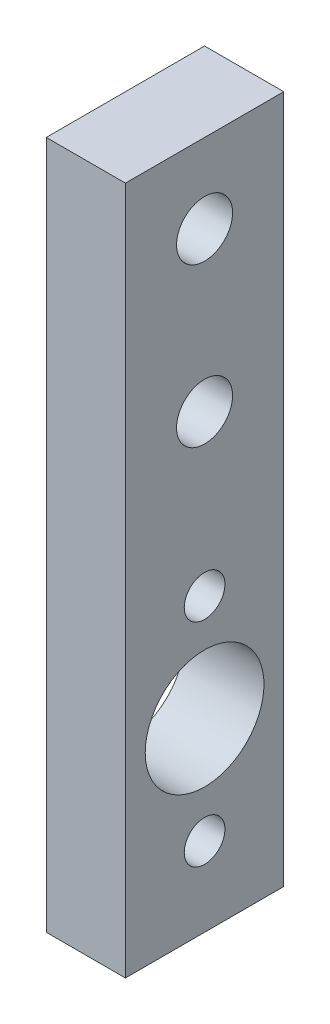
ISO-10303-21;
HEADER;
FILE_DESCRIPTION(('STEP AP214'),'2;1');
FILE_NAME('part.step','',(''),(''),'','','');
FILE_SCHEMA(('AUTOMOTIVE_DESIGN { 1 0 10303 214 1 1 1 1 }'));
ENDSEC;
DATA;
#1=APPLICATION_CONTEXT('core data for automotive mechanical design processes');
#2=APPLICATION_PROTOCOL_DEFINITION('international standard','automotive_design',2000,#1);
#3=PRODUCT_CONTEXT('',#1,'mechanical');
#4=PRODUCT('Part','Part','',(#3));
#5=PRODUCT_RELATED_PRODUCT_CATEGORY('part','',(#4));
#6=PRODUCT_DEFINITION_FORMATION('','',#4);
#7=PRODUCT_DEFINITION_CONTEXT('part definition',#1,'design');
#8=PRODUCT_DEFINITION('design','',#6,#7);
#9=PRODUCT_DEFINITION_SHAPE('','',#8);
#10=(LENGTH_UNIT() NAMED_UNIT(*) SI_UNIT(.MILLI.,.METRE.));
#11=(NAMED_UNIT(*) PLANE_ANGLE_UNIT() SI_UNIT($,.RADIAN.));
#12=(NAMED_UNIT(*) SI_UNIT($,.STERADIAN.) SOLID_ANGLE_UNIT());
#13=UNCERTAINTY_MEASURE_WITH_UNIT(LENGTH_MEASURE(1.E-05),#10,'distance_accuracy_value','');
#14=(GEOMETRIC_REPRESENTATION_CONTEXT(3) GLOBAL_UNCERTAINTY_ASSIGNED_CONTEXT((#13)) GLOBAL_UNIT_ASSIGNED_CONTEXT((#10,
#11,#12)) REPRESENTATION_CONTEXT('',''));
#15=CARTESIAN_POINT('',(0.,0.,0.));
#16=DIRECTION('',(0.,0.,1.));
#17=DIRECTION('',(1.,0.,0.));
#18=AXIS2_PLACEMENT_3D('',#15,#16,#17);
#19=CARTESIAN_POINT('',(-40.64,0.,0.));
#20=DIRECTION('',(-1.,0.,0.));
#21=DIRECTION('',(0.,0.,1.));
#22=AXIS2_PLACEMENT_3D('',#19,#20,#21);
#23=PLANE('',#22);
#24=CARTESIAN_POINT('',(-40.64,19.05,16.825));
#25=DIRECTION('',(-1.,0.,0.));
#26=DIRECTION('',(0.,0.,1.));
#27=AXIS2_PLACEMENT_3D('',#24,#25,#26);
#28=CIRCLE('',#27,2.2479);
#29=CARTESIAN_POINT('',(-40.64,19.05,19.0729));
#30=VERTEX_POINT('',#29);
#31=EDGE_CURVE('E188',#30,#30,#28,.T.);
#32=ORIENTED_EDGE('',*,*,#31,.T.);
#33=EDGE_LOOP('',(#32));
#34=FACE_BOUND('',#33,.T.);
#35=CARTESIAN_POINT('',(-40.64,6.35,16.825));
#36=DIRECTION('',(-1.,0.,0.));
#37=DIRECTION('',(0.,0.,1.));
#38=AXIS2_PLACEMENT_3D('',#35,#36,#37);
#39=CIRCLE('',#38,2.2479);
#40=CARTESIAN_POINT('',(-40.64,6.35,19.0729));
#41=VERTEX_POINT('',#40);
#42=EDGE_CURVE('E191',#41,#41,#39,.T.);
#43=ORIENTED_EDGE('',*,*,#42,.T.);
#44=EDGE_LOOP('',(#43));
#45=FACE_BOUND('',#44,.T.);
#46=CARTESIAN_POINT('',(-40.64,-23.469,16.825));
#47=DIRECTION('',(-1.,0.,0.));
#48=DIRECTION('',(0.,0.,1.));
#49=AXIS2_PLACEMENT_3D('',#46,#47,#48);
#50=CIRCLE('',#49,1.63195);
#51=CARTESIAN_POINT('',(-40.64,-23.469,18.45695));
#52=VERTEX_POINT('',#51);
#53=EDGE_CURVE('E102',#52,#52,#50,.T.);
#54=ORIENTED_EDGE('',*,*,#53,.T.);
#55=EDGE_LOOP('',(#54));
#56=FACE_BOUND('',#55,.T.);
#57=CARTESIAN_POINT('',(-40.64,-6.451,16.825));
#58=DIRECTION('',(-1.,0.,0.));
#59=DIRECTION('',(0.,0.,1.));
#60=AXIS2_PLACEMENT_3D('',#57,#58,#59);
#61=CIRCLE('',#60,1.63195);
#62=CARTESIAN_POINT('',(-40.64,-6.451,18.45695));
#63=VERTEX_POINT('',#62);
#64=EDGE_CURVE('E108',#63,#63,#61,.T.);
#65=ORIENTED_EDGE('',*,*,#64,.T.);
#66=EDGE_LOOP('',(#65));
#67=FACE_BOUND('',#66,.T.);
#68=CARTESIAN_POINT('',(-40.64,-14.96,16.825));
#69=DIRECTION('',(-1.,0.,0.));
#70=DIRECTION('',(0.,0.,1.));
#71=AXIS2_PLACEMENT_3D('',#68,#69,#70);
#72=CIRCLE('',#71,4.7625);
#73=CARTESIAN_POINT('',(-40.64,-14.96,21.5875));
#74=VERTEX_POINT('',#73);
#75=EDGE_CURVE('E43',#74,#74,#72,.T.);
#76=ORIENTED_EDGE('',*,*,#75,.T.);
#77=EDGE_LOOP('',(#76));
#78=FACE_BOUND('',#77,.T.);
#79=DIRECTION('',(0.,-1.,0.));
#80=VECTOR('',#79,1.);
#81=CARTESIAN_POINT('',(-40.64,25.4,10.475));
#82=LINE('',#81,#80);
#83=CARTESIAN_POINT('',(-40.64,25.4,10.475));
#84=VERTEX_POINT('',#83);
#85=CARTESIAN_POINT('',(-40.64,-29.819,10.475));
#86=VERTEX_POINT('',#85);
#87=EDGE_CURVE('E57',#84,#86,#82,.T.);
#88=ORIENTED_EDGE('',*,*,#87,.F.);
#89=DIRECTION('',(0.,0.,-1.));
#90=VECTOR('',#89,1.);
#91=CARTESIAN_POINT('',(-40.64,25.4,0.));
#92=LINE('',#91,#90);
#93=CARTESIAN_POINT('',(-40.64,25.4,23.175));
#94=VERTEX_POINT('',#93);
#95=EDGE_CURVE('E11',#94,#84,#92,.T.);
#96=ORIENTED_EDGE('',*,*,#95,.F.);
#97=DIRECTION('',(0.,1.,0.));
#98=VECTOR('',#97,1.);
#99=CARTESIAN_POINT('',(-40.64,25.4,23.175));
#100=LINE('',#99,#98);
#101=CARTESIAN_POINT('',(-40.64,-29.819,23.175));
#102=VERTEX_POINT('',#101);
#103=EDGE_CURVE('E50',#102,#94,#100,.T.);
#104=ORIENTED_EDGE('',*,*,#103,.F.);
#105=DIRECTION('',(0.,0.,1.));
#106=VECTOR('',#105,1.);
#107=CARTESIAN_POINT('',(-40.64,-29.819,10.475));
#108=LINE('',#107,#106);
#109=EDGE_CURVE('E76',#86,#102,#108,.T.);
#110=ORIENTED_EDGE('',*,*,#109,.F.);
#111=EDGE_LOOP('',(#88,#96,#104,#110));
#112=FACE_BOUND('',#111,.T.);
#113=ADVANCED_FACE('F35',(#34,#45,#56,#67,#78,#112),#23,.F.);
#114=CARTESIAN_POINT('',(-46.99,0.,0.));
#115=DIRECTION('',(-1.,0.,0.));
#116=DIRECTION('',(0.,0.,1.));
#117=AXIS2_PLACEMENT_3D('',#114,#115,#116);
#118=PLANE('',#117);
#119=CARTESIAN_POINT('',(-46.99,19.05,16.825));
#120=DIRECTION('',(-1.,0.,0.));
#121=DIRECTION('',(0.,0.,1.));
#122=AXIS2_PLACEMENT_3D('',#119,#120,#121);
#123=CIRCLE('',#122,2.2479);
#124=CARTESIAN_POINT('',(-46.99,19.05,19.0729));
#125=VERTEX_POINT('',#124);
#126=EDGE_CURVE('E194',#125,#125,#123,.T.);
#127=ORIENTED_EDGE('',*,*,#126,.F.);
#128=EDGE_LOOP('',(#127));
#129=FACE_BOUND('',#128,.T.);
#130=CARTESIAN_POINT('',(-46.99,6.35,16.825));
#131=DIRECTION('',(-1.,0.,0.));
#132=DIRECTION('',(0.,0.,1.));
#133=AXIS2_PLACEMENT_3D('',#130,#131,#132);
#134=CIRCLE('',#133,2.2479);
#135=CARTESIAN_POINT('',(-46.99,6.35,19.0729));
#136=VERTEX_POINT('',#135);
#137=EDGE_CURVE('E195',#136,#136,#134,.T.);
#138=ORIENTED_EDGE('',*,*,#137,.F.);
#139=EDGE_LOOP('',(#138));
#140=FACE_BOUND('',#139,.T.);
#141=CARTESIAN_POINT('',(-46.99,-6.451,16.825));
#142=DIRECTION('',(-1.,0.,0.));
#143=DIRECTION('',(0.,0.,1.));
#144=AXIS2_PLACEMENT_3D('',#141,#142,#143);
#145=CIRCLE('',#144,1.63195);
#146=CARTESIAN_POINT('',(-46.99,-6.451,18.45695));
#147=VERTEX_POINT('',#146);
#148=EDGE_CURVE('E105',#147,#147,#145,.T.);
#149=ORIENTED_EDGE('',*,*,#148,.F.);
#150=EDGE_LOOP('',(#149));
#151=FACE_BOUND('',#150,.T.);
#152=DIRECTION('',(0.,-1.,0.));
#153=VECTOR('',#152,1.);
#154=CARTESIAN_POINT('',(-46.99,25.4,10.475));
#155=LINE('',#154,#153);
#156=CARTESIAN_POINT('',(-46.99,25.4,10.475));
#157=VERTEX_POINT('',#156);
#158=CARTESIAN_POINT('',(-46.99,-29.819,10.475));
#159=VERTEX_POINT('',#158);
#160=EDGE_CURVE('E89',#157,#159,#155,.T.);
#161=ORIENTED_EDGE('',*,*,#160,.T.);
#162=DIRECTION('',(0.,0.,1.));
#163=VECTOR('',#162,1.);
#164=CARTESIAN_POINT('',(-46.99,-29.819,10.475));
#165=LINE('',#164,#163);
#166=CARTESIAN_POINT('',(-46.99,-29.819,23.175));
#167=VERTEX_POINT('',#166);
#168=EDGE_CURVE('E92',#159,#167,#165,.T.);
#169=ORIENTED_EDGE('',*,*,#168,.T.);
#170=DIRECTION('',(0.,1.,0.));
#171=VECTOR('',#170,1.);
#172=CARTESIAN_POINT('',(-46.99,25.4,23.175));
#173=LINE('',#172,#171);
#174=CARTESIAN_POINT('',(-46.99,25.4,23.175));
#175=VERTEX_POINT('',#174);
#176=EDGE_CURVE('E85',#167,#175,#173,.T.);
#177=ORIENTED_EDGE('',*,*,#176,.T.);
#178=DIRECTION('',(0.,0.,-1.));
#179=VECTOR('',#178,1.);
#180=CARTESIAN_POINT('',(-46.99,25.4,10.475));
#181=LINE('',#180,#179);
#182=EDGE_CURVE('E86',#175,#157,#181,.T.);
#183=ORIENTED_EDGE('',*,*,#182,.T.);
#184=EDGE_LOOP('',(#161,#169,#177,#183));
#185=FACE_BOUND('',#184,.T.);
#186=CARTESIAN_POINT('',(-46.99,-23.469,16.825));
#187=DIRECTION('',(-1.,0.,0.));
#188=DIRECTION('',(0.,0.,1.));
#189=AXIS2_PLACEMENT_3D('',#186,#187,#188);
#190=CIRCLE('',#189,1.63195);
#191=CARTESIAN_POINT('',(-46.99,-23.469,18.45695));
#192=VERTEX_POINT('',#191);
#193=EDGE_CURVE('E97',#192,#192,#190,.T.);
#194=ORIENTED_EDGE('',*,*,#193,.F.);
#195=EDGE_LOOP('',(#194));
#196=FACE_BOUND('',#195,.T.);
#197=CARTESIAN_POINT('',(-46.99,-14.96,16.825));
#198=DIRECTION('',(-1.,0.,0.));
#199=DIRECTION('',(0.,0.,1.));
#200=AXIS2_PLACEMENT_3D('',#197,#198,#199);
#201=CIRCLE('',#200,4.7625);
#202=CARTESIAN_POINT('',(-46.99,-14.96,21.5875));
#203=VERTEX_POINT('',#202);
#204=EDGE_CURVE('E111',#203,#203,#201,.T.);
#205=ORIENTED_EDGE('',*,*,#204,.F.);
#206=EDGE_LOOP('',(#205));
#207=FACE_BOUND('',#206,.T.);
#208=ADVANCED_FACE('F121',(#129,#140,#151,#185,#196,#207),#118,.T.);
#209=CARTESIAN_POINT('',(-46.99,-29.819,10.475));
#210=DIRECTION('',(0.,1.,0.));
#211=DIRECTION('',(0.,0.,1.));
#212=AXIS2_PLACEMENT_3D('',#209,#210,#211);
#213=PLANE('',#212);
#214=ORIENTED_EDGE('',*,*,#109,.T.);
#215=DIRECTION('',(1.,0.,0.));
#216=VECTOR('',#215,1.);
#217=CARTESIAN_POINT('',(-46.99,-29.819,23.175));
#218=LINE('',#217,#216);
#219=EDGE_CURVE('E78',#167,#102,#218,.T.);
#220=ORIENTED_EDGE('',*,*,#219,.F.);
#221=ORIENTED_EDGE('',*,*,#168,.F.);
#222=DIRECTION('',(1.,0.,0.));
#223=VECTOR('',#222,1.);
#224=CARTESIAN_POINT('',(-46.99,-29.819,10.475));
#225=LINE('',#224,#223);
#226=EDGE_CURVE('E81',#159,#86,#225,.T.);
#227=ORIENTED_EDGE('',*,*,#226,.T.);
#228=EDGE_LOOP('',(#214,#220,#221,#227));
#229=FACE_BOUND('',#228,.T.);
#230=ADVANCED_FACE('F77',(#229),#213,.F.);
#231=CARTESIAN_POINT('',(0.,25.4,0.));
#232=DIRECTION('',(0.,-1.,0.));
#233=DIRECTION('',(0.,0.,-1.));
#234=AXIS2_PLACEMENT_3D('',#231,#232,#233);
#235=PLANE('',#234);
#236=DIRECTION('',(1.,0.,0.));
#237=VECTOR('',#236,1.);
#238=CARTESIAN_POINT('',(-40.64,25.4,23.175));
#239=LINE('',#238,#237);
#240=EDGE_CURVE('E184',#175,#94,#239,.T.);
#241=ORIENTED_EDGE('',*,*,#240,.T.);
#242=ORIENTED_EDGE('',*,*,#95,.T.);
#243=DIRECTION('',(1.,0.,0.));
#244=VECTOR('',#243,1.);
#245=CARTESIAN_POINT('',(-40.64,25.4,10.475));
#246=LINE('',#245,#244);
#247=EDGE_CURVE('E183',#157,#84,#246,.T.);
#248=ORIENTED_EDGE('',*,*,#247,.F.);
#249=ORIENTED_EDGE('',*,*,#182,.F.);
#250=EDGE_LOOP('',(#241,#242,#248,#249));
#251=FACE_BOUND('',#250,.T.);
#252=ADVANCED_FACE('F37',(#251),#235,.F.);
#253=CARTESIAN_POINT('',(-40.64,25.4,10.475));
#254=DIRECTION('',(0.,0.,1.));
#255=DIRECTION('',(0.,-1.,0.));
#256=AXIS2_PLACEMENT_3D('',#253,#254,#255);
#257=PLANE('',#256);
#258=ORIENTED_EDGE('',*,*,#247,.T.);
#259=ORIENTED_EDGE('',*,*,#87,.T.);
#260=ORIENTED_EDGE('',*,*,#226,.F.);
#261=ORIENTED_EDGE('',*,*,#160,.F.);
#262=EDGE_LOOP('',(#258,#259,#260,#261));
#263=FACE_BOUND('',#262,.T.);
#264=ADVANCED_FACE('F152',(#263),#257,.F.);
#265=CARTESIAN_POINT('',(-40.64,25.4,23.175));
#266=DIRECTION('',(0.,0.,-1.));
#267=DIRECTION('',(-1.,0.,0.));
#268=AXIS2_PLACEMENT_3D('',#265,#266,#267);
#269=PLANE('',#268);
#270=ORIENTED_EDGE('',*,*,#103,.T.);
#271=ORIENTED_EDGE('',*,*,#240,.F.);
#272=ORIENTED_EDGE('',*,*,#176,.F.);
#273=ORIENTED_EDGE('',*,*,#219,.T.);
#274=EDGE_LOOP('',(#270,#271,#272,#273));
#275=FACE_BOUND('',#274,.T.);
#276=ADVANCED_FACE('F83',(#275),#269,.F.);
#277=CARTESIAN_POINT('',(-46.99,-14.96,16.825));
#278=DIRECTION('',(1.,0.,0.));
#279=DIRECTION('',(0.,0.,-1.));
#280=AXIS2_PLACEMENT_3D('',#277,#278,#279);
#281=CYLINDRICAL_SURFACE('',#280,4.7625);
#282=ORIENTED_EDGE('',*,*,#204,.T.);
#283=EDGE_LOOP('',(#282));
#284=FACE_BOUND('',#283,.T.);
#285=ORIENTED_EDGE('',*,*,#75,.F.);
#286=EDGE_LOOP('',(#285));
#287=FACE_BOUND('',#286,.T.);
#288=ADVANCED_FACE('F118',(#284,#287),#281,.F.);
#289=CARTESIAN_POINT('',(-46.99,-6.451,16.825));
#290=DIRECTION('',(1.,0.,0.));
#291=DIRECTION('',(0.,0.,-1.));
#292=AXIS2_PLACEMENT_3D('',#289,#290,#291);
#293=CYLINDRICAL_SURFACE('',#292,1.63195);
#294=ORIENTED_EDGE('',*,*,#148,.T.);
#295=EDGE_LOOP('',(#294));
#296=FACE_BOUND('',#295,.T.);
#297=ORIENTED_EDGE('',*,*,#64,.F.);
#298=EDGE_LOOP('',(#297));
#299=FACE_BOUND('',#298,.T.);
#300=ADVANCED_FACE('F147',(#296,#299),#293,.F.);
#301=CARTESIAN_POINT('',(-46.99,-23.469,16.825));
#302=DIRECTION('',(1.,0.,0.));
#303=DIRECTION('',(0.,0.,-1.));
#304=AXIS2_PLACEMENT_3D('',#301,#302,#303);
#305=CYLINDRICAL_SURFACE('',#304,1.63195);
#306=ORIENTED_EDGE('',*,*,#193,.T.);
#307=EDGE_LOOP('',(#306));
#308=FACE_BOUND('',#307,.T.);
#309=ORIENTED_EDGE('',*,*,#53,.F.);
#310=EDGE_LOOP('',(#309));
#311=FACE_BOUND('',#310,.T.);
#312=ADVANCED_FACE('F133',(#308,#311),#305,.F.);
#313=CARTESIAN_POINT('',(40.64,6.35,16.825));
#314=DIRECTION('',(-1.,0.,0.));
#315=DIRECTION('',(0.,0.,1.));
#316=AXIS2_PLACEMENT_3D('',#313,#314,#315);
#317=CYLINDRICAL_SURFACE('',#316,2.2479);
#318=ORIENTED_EDGE('',*,*,#137,.T.);
#319=EDGE_LOOP('',(#318));
#320=FACE_BOUND('',#319,.T.);
#321=ORIENTED_EDGE('',*,*,#42,.F.);
#322=EDGE_LOOP('',(#321));
#323=FACE_BOUND('',#322,.T.);
#324=ADVANCED_FACE('F125',(#320,#323),#317,.F.);
#325=CARTESIAN_POINT('',(40.64,19.05,16.825));
#326=DIRECTION('',(-1.,0.,0.));
#327=DIRECTION('',(0.,0.,1.));
#328=AXIS2_PLACEMENT_3D('',#325,#326,#327);
#329=CYLINDRICAL_SURFACE('',#328,2.2479);
#330=ORIENTED_EDGE('',*,*,#126,.T.);
#331=EDGE_LOOP('',(#330));
#332=FACE_BOUND('',#331,.T.);
#333=ORIENTED_EDGE('',*,*,#31,.F.);
#334=EDGE_LOOP('',(#333));
#335=FACE_BOUND('',#334,.T.);
#336=ADVANCED_FACE('F138',(#332,#335),#329,.F.);
#337=CLOSED_SHELL('',(#113,#208,#230,#252,#264,#276,#288,#300,#312,#324,#336));
#338=MANIFOLD_SOLID_BREP('B2',#337);
#339=ADVANCED_BREP_SHAPE_REPRESENTATION('',(#18,#338),#14);
#340=SHAPE_DEFINITION_REPRESENTATION(#9,#339);
ENDSEC;
END-ISO-10303-21;
